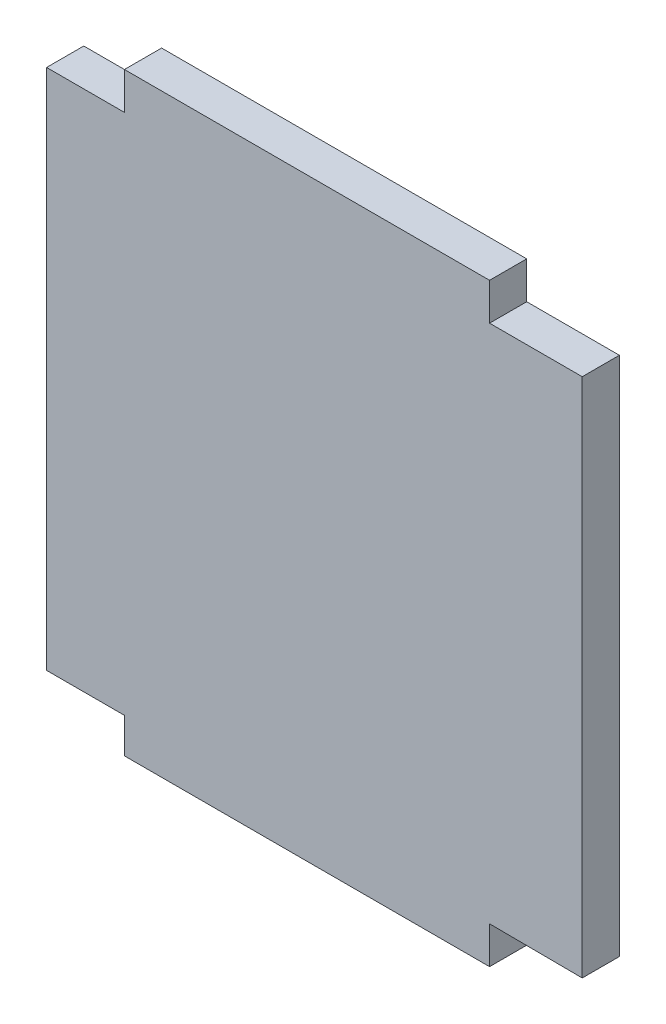
ISO-10303-21;
HEADER;
FILE_DESCRIPTION(('STEP AP214'),'2;1');
FILE_NAME('part.step','',(''),(''),'','','');
FILE_SCHEMA(('AUTOMOTIVE_DESIGN { 1 0 10303 214 1 1 1 1 }'));
ENDSEC;
DATA;
#1=APPLICATION_CONTEXT('core data for automotive mechanical design processes');
#2=APPLICATION_PROTOCOL_DEFINITION('international standard','automotive_design',2000,#1);
#3=PRODUCT_CONTEXT('',#1,'mechanical');
#4=PRODUCT('Part','Part','',(#3));
#5=PRODUCT_RELATED_PRODUCT_CATEGORY('part','',(#4));
#6=PRODUCT_DEFINITION_FORMATION('','',#4);
#7=PRODUCT_DEFINITION_CONTEXT('part definition',#1,'design');
#8=PRODUCT_DEFINITION('design','',#6,#7);
#9=PRODUCT_DEFINITION_SHAPE('','',#8);
#10=(LENGTH_UNIT() NAMED_UNIT(*) SI_UNIT(.MILLI.,.METRE.));
#11=(NAMED_UNIT(*) PLANE_ANGLE_UNIT() SI_UNIT($,.RADIAN.));
#12=(NAMED_UNIT(*) SI_UNIT($,.STERADIAN.) SOLID_ANGLE_UNIT());
#13=UNCERTAINTY_MEASURE_WITH_UNIT(LENGTH_MEASURE(1.E-05),#10,'distance_accuracy_value','');
#14=(GEOMETRIC_REPRESENTATION_CONTEXT(3) GLOBAL_UNCERTAINTY_ASSIGNED_CONTEXT((#13)) GLOBAL_UNIT_ASSIGNED_CONTEXT((#10,
#11,#12)) REPRESENTATION_CONTEXT('',''));
#15=CARTESIAN_POINT('',(0.,0.,0.));
#16=DIRECTION('',(0.,0.,1.));
#17=DIRECTION('',(1.,0.,0.));
#18=AXIS2_PLACEMENT_3D('',#15,#16,#17);
#19=CARTESIAN_POINT('',(-60.7832696373602,115.911666867358,5.08));
#20=DIRECTION('',(0.,-1.,0.));
#21=DIRECTION('',(0.,0.,-1.));
#22=AXIS2_PLACEMENT_3D('',#19,#20,#21);
#23=PLANE('',#22);
#24=DIRECTION('',(-1.,0.,0.));
#25=VECTOR('',#24,1.);
#26=CARTESIAN_POINT('',(-60.7832696373602,115.911666867358,0.));
#27=LINE('',#26,#25);
#28=CARTESIAN_POINT('',(-60.7832696373602,115.911666867358,0.));
#29=VERTEX_POINT('',#28);
#30=CARTESIAN_POINT('',(-71.4262491907789,115.911666867358,0.));
#31=VERTEX_POINT('',#30);
#32=EDGE_CURVE('E152',#29,#31,#27,.T.);
#33=ORIENTED_EDGE('',*,*,#32,.T.);
#34=DIRECTION('',(0.,0.,-1.));
#35=VECTOR('',#34,1.);
#36=CARTESIAN_POINT('',(-71.4262491907789,115.911666867358,5.08));
#37=LINE('',#36,#35);
#38=CARTESIAN_POINT('',(-71.4262491907789,115.911666867358,5.08));
#39=VERTEX_POINT('',#38);
#40=EDGE_CURVE('E11',#39,#31,#37,.T.);
#41=ORIENTED_EDGE('',*,*,#40,.F.);
#42=DIRECTION('',(-1.,0.,0.));
#43=VECTOR('',#42,1.);
#44=CARTESIAN_POINT('',(-60.7832696373602,115.911666867358,5.08));
#45=LINE('',#44,#43);
#46=CARTESIAN_POINT('',(-60.7832696373602,115.911666867358,5.08));
#47=VERTEX_POINT('',#46);
#48=EDGE_CURVE('E98',#47,#39,#45,.T.);
#49=ORIENTED_EDGE('',*,*,#48,.F.);
#50=DIRECTION('',(0.,0.,-1.));
#51=VECTOR('',#50,1.);
#52=CARTESIAN_POINT('',(-60.7832696373602,115.911666867358,5.08));
#53=LINE('',#52,#51);
#54=EDGE_CURVE('E49',#47,#29,#53,.T.);
#55=ORIENTED_EDGE('',*,*,#54,.T.);
#56=EDGE_LOOP('',(#33,#41,#49,#55));
#57=FACE_BOUND('',#56,.T.);
#58=ADVANCED_FACE('F33',(#57),#23,.F.);
#59=CARTESIAN_POINT('',(-71.4262491907789,44.5113060352469,5.08));
#60=DIRECTION('',(-1.,0.,0.));
#61=DIRECTION('',(0.,0.,1.));
#62=AXIS2_PLACEMENT_3D('',#59,#60,#61);
#63=PLANE('',#62);
#64=DIRECTION('',(0.,1.,0.));
#65=VECTOR('',#64,1.);
#66=CARTESIAN_POINT('',(-71.4262491907789,44.5113060352469,0.));
#67=LINE('',#66,#65);
#68=CARTESIAN_POINT('',(-71.4262491907789,44.5113060352469,0.));
#69=VERTEX_POINT('',#68);
#70=EDGE_CURVE('E154',#69,#31,#67,.T.);
#71=ORIENTED_EDGE('',*,*,#70,.F.);
#72=DIRECTION('',(0.,0.,-1.));
#73=VECTOR('',#72,1.);
#74=CARTESIAN_POINT('',(-71.4262491907789,44.5113060352469,5.08));
#75=LINE('',#74,#73);
#76=CARTESIAN_POINT('',(-71.4262491907789,44.5113060352469,5.08));
#77=VERTEX_POINT('',#76);
#78=EDGE_CURVE('E41',#77,#69,#75,.T.);
#79=ORIENTED_EDGE('',*,*,#78,.F.);
#80=DIRECTION('',(0.,1.,0.));
#81=VECTOR('',#80,1.);
#82=CARTESIAN_POINT('',(-71.4262491907789,44.5113060352469,5.08));
#83=LINE('',#82,#81);
#84=EDGE_CURVE('E211',#77,#39,#83,.T.);
#85=ORIENTED_EDGE('',*,*,#84,.T.);
#86=ORIENTED_EDGE('',*,*,#40,.T.);
#87=EDGE_LOOP('',(#71,#79,#85,#86));
#88=FACE_BOUND('',#87,.T.);
#89=ADVANCED_FACE('F210',(#88),#63,.T.);
#90=CARTESIAN_POINT('',(-71.4262491907789,44.5113060352469,5.08));
#91=DIRECTION('',(0.,1.,0.));
#92=DIRECTION('',(0.,0.,1.));
#93=AXIS2_PLACEMENT_3D('',#90,#91,#92);
#94=PLANE('',#93);
#95=DIRECTION('',(1.,0.,0.));
#96=VECTOR('',#95,1.);
#97=CARTESIAN_POINT('',(-71.4262491907789,44.5113060352469,0.));
#98=LINE('',#97,#96);
#99=CARTESIAN_POINT('',(-60.7832696373601,44.5113060352469,0.));
#100=VERTEX_POINT('',#99);
#101=EDGE_CURVE('E157',#69,#100,#98,.T.);
#102=ORIENTED_EDGE('',*,*,#101,.T.);
#103=DIRECTION('',(0.,0.,-1.));
#104=VECTOR('',#103,1.);
#105=CARTESIAN_POINT('',(-60.7832696373601,44.5113060352469,5.08));
#106=LINE('',#105,#104);
#107=CARTESIAN_POINT('',(-60.7832696373601,44.5113060352469,5.08));
#108=VERTEX_POINT('',#107);
#109=EDGE_CURVE('E197',#108,#100,#106,.T.);
#110=ORIENTED_EDGE('',*,*,#109,.F.);
#111=DIRECTION('',(1.,0.,0.));
#112=VECTOR('',#111,1.);
#113=CARTESIAN_POINT('',(-71.4262491907789,44.5113060352469,5.08));
#114=LINE('',#113,#112);
#115=EDGE_CURVE('E203',#77,#108,#114,.T.);
#116=ORIENTED_EDGE('',*,*,#115,.F.);
#117=ORIENTED_EDGE('',*,*,#78,.T.);
#118=EDGE_LOOP('',(#102,#110,#116,#117));
#119=FACE_BOUND('',#118,.T.);
#120=ADVANCED_FACE('F201',(#119),#94,.F.);
#121=CARTESIAN_POINT('',(-60.7832696373601,39.7116668673583,5.08));
#122=DIRECTION('',(-1.,0.,0.));
#123=DIRECTION('',(0.,0.,1.));
#124=AXIS2_PLACEMENT_3D('',#121,#122,#123);
#125=PLANE('',#124);
#126=DIRECTION('',(0.,1.,0.));
#127=VECTOR('',#126,1.);
#128=CARTESIAN_POINT('',(-60.7832696373601,39.7116668673583,0.));
#129=LINE('',#128,#127);
#130=CARTESIAN_POINT('',(-60.7832696373601,39.7116668673583,0.));
#131=VERTEX_POINT('',#130);
#132=EDGE_CURVE('E160',#131,#100,#129,.T.);
#133=ORIENTED_EDGE('',*,*,#132,.F.);
#134=DIRECTION('',(0.,0.,-1.));
#135=VECTOR('',#134,1.);
#136=CARTESIAN_POINT('',(-60.7832696373601,39.7116668673583,5.08));
#137=LINE('',#136,#135);
#138=CARTESIAN_POINT('',(-60.7832696373601,39.7116668673583,5.08));
#139=VERTEX_POINT('',#138);
#140=EDGE_CURVE('E195',#139,#131,#137,.T.);
#141=ORIENTED_EDGE('',*,*,#140,.F.);
#142=DIRECTION('',(0.,1.,0.));
#143=VECTOR('',#142,1.);
#144=CARTESIAN_POINT('',(-60.7832696373601,39.7116668673583,5.08));
#145=LINE('',#144,#143);
#146=EDGE_CURVE('E352',#139,#108,#145,.T.);
#147=ORIENTED_EDGE('',*,*,#146,.T.);
#148=ORIENTED_EDGE('',*,*,#109,.T.);
#149=EDGE_LOOP('',(#133,#141,#147,#148));
#150=FACE_BOUND('',#149,.T.);
#151=ADVANCED_FACE('F229',(#150),#125,.T.);
#152=CARTESIAN_POINT('',(-10.8593708258029,39.7116668673583,5.08));
#153=DIRECTION('',(0.,-1.,0.));
#154=DIRECTION('',(0.,0.,-1.));
#155=AXIS2_PLACEMENT_3D('',#152,#153,#154);
#156=PLANE('',#155);
#157=DIRECTION('',(-1.,0.,0.));
#158=VECTOR('',#157,1.);
#159=CARTESIAN_POINT('',(-10.8593708258029,39.7116668673583,0.));
#160=LINE('',#159,#158);
#161=CARTESIAN_POINT('',(-10.8593708258029,39.7116668673583,0.));
#162=VERTEX_POINT('',#161);
#163=EDGE_CURVE('E163',#162,#131,#160,.T.);
#164=ORIENTED_EDGE('',*,*,#163,.F.);
#165=DIRECTION('',(0.,0.,-1.));
#166=VECTOR('',#165,1.);
#167=CARTESIAN_POINT('',(-10.8593708258029,39.7116668673583,5.08));
#168=LINE('',#167,#166);
#169=CARTESIAN_POINT('',(-10.8593708258029,39.7116668673583,5.08));
#170=VERTEX_POINT('',#169);
#171=EDGE_CURVE('E193',#170,#162,#168,.T.);
#172=ORIENTED_EDGE('',*,*,#171,.F.);
#173=DIRECTION('',(-1.,0.,0.));
#174=VECTOR('',#173,1.);
#175=CARTESIAN_POINT('',(-10.8593708258029,39.7116668673583,5.08));
#176=LINE('',#175,#174);
#177=EDGE_CURVE('E349',#170,#139,#176,.T.);
#178=ORIENTED_EDGE('',*,*,#177,.T.);
#179=ORIENTED_EDGE('',*,*,#140,.T.);
#180=EDGE_LOOP('',(#164,#172,#178,#179));
#181=FACE_BOUND('',#180,.T.);
#182=ADVANCED_FACE('F234',(#181),#156,.T.);
#183=CARTESIAN_POINT('',(-10.8593708258029,44.7916668673583,5.08));
#184=DIRECTION('',(1.,0.,0.));
#185=DIRECTION('',(0.,0.,-1.));
#186=AXIS2_PLACEMENT_3D('',#183,#184,#185);
#187=PLANE('',#186);
#188=DIRECTION('',(0.,-1.,0.));
#189=VECTOR('',#188,1.);
#190=CARTESIAN_POINT('',(-10.8593708258029,44.7916668673583,0.));
#191=LINE('',#190,#189);
#192=CARTESIAN_POINT('',(-10.8593708258029,44.7916668673583,0.));
#193=VERTEX_POINT('',#192);
#194=EDGE_CURVE('E166',#193,#162,#191,.T.);
#195=ORIENTED_EDGE('',*,*,#194,.F.);
#196=DIRECTION('',(0.,0.,-1.));
#197=VECTOR('',#196,1.);
#198=CARTESIAN_POINT('',(-10.8593708258029,44.7916668673583,5.08));
#199=LINE('',#198,#197);
#200=CARTESIAN_POINT('',(-10.8593708258029,44.7916668673583,5.08));
#201=VERTEX_POINT('',#200);
#202=EDGE_CURVE('E191',#201,#193,#199,.T.);
#203=ORIENTED_EDGE('',*,*,#202,.F.);
#204=DIRECTION('',(0.,-1.,0.));
#205=VECTOR('',#204,1.);
#206=CARTESIAN_POINT('',(-10.8593708258029,44.7916668673583,5.08));
#207=LINE('',#206,#205);
#208=EDGE_CURVE('E354',#201,#170,#207,.T.);
#209=ORIENTED_EDGE('',*,*,#208,.T.);
#210=ORIENTED_EDGE('',*,*,#171,.T.);
#211=EDGE_LOOP('',(#195,#203,#209,#210));
#212=FACE_BOUND('',#211,.T.);
#213=ADVANCED_FACE('F238',(#212),#187,.T.);
#214=CARTESIAN_POINT('',(1.81378225928519,44.7079104796684,5.08));
#215=DIRECTION('',(-0.00660881771220687,-0.999978161525764,0.));
#216=DIRECTION('',(0.999978161525764,-0.00660881771220687,0.));
#217=AXIS2_PLACEMENT_3D('',#214,#215,#216);
#218=PLANE('',#217);
#219=DIRECTION('',(-0.999978161525764,0.00660881771220687,0.));
#220=VECTOR('',#219,1.);
#221=CARTESIAN_POINT('',(1.81378225928519,44.7079104796684,0.));
#222=LINE('',#221,#220);
#223=CARTESIAN_POINT('',(1.81378225928519,44.7079104796684,0.));
#224=VERTEX_POINT('',#223);
#225=EDGE_CURVE('E169',#224,#193,#222,.T.);
#226=ORIENTED_EDGE('',*,*,#225,.F.);
#227=DIRECTION('',(0.,0.,-1.));
#228=VECTOR('',#227,1.);
#229=CARTESIAN_POINT('',(1.81378225928519,44.7079104796684,5.08));
#230=LINE('',#229,#228);
#231=CARTESIAN_POINT('',(1.81378225928519,44.7079104796684,5.08));
#232=VERTEX_POINT('',#231);
#233=EDGE_CURVE('E189',#232,#224,#230,.T.);
#234=ORIENTED_EDGE('',*,*,#233,.F.);
#235=DIRECTION('',(-0.999978161525764,0.00660881771220687,0.));
#236=VECTOR('',#235,1.);
#237=CARTESIAN_POINT('',(1.81378225928519,44.7079104796684,5.08));
#238=LINE('',#237,#236);
#239=EDGE_CURVE('E343',#232,#201,#238,.T.);
#240=ORIENTED_EDGE('',*,*,#239,.T.);
#241=ORIENTED_EDGE('',*,*,#202,.T.);
#242=EDGE_LOOP('',(#226,#234,#240,#241));
#243=FACE_BOUND('',#242,.T.);
#244=ADVANCED_FACE('F242',(#243),#218,.T.);
#245=CARTESIAN_POINT('',(1.81378225928519,115.911666867358,5.08));
#246=DIRECTION('',(1.,0.,0.));
#247=DIRECTION('',(0.,0.,-1.));
#248=AXIS2_PLACEMENT_3D('',#245,#246,#247);
#249=PLANE('',#248);
#250=DIRECTION('',(0.,-1.,0.));
#251=VECTOR('',#250,1.);
#252=CARTESIAN_POINT('',(1.81378225928519,115.911666867358,0.));
#253=LINE('',#252,#251);
#254=CARTESIAN_POINT('',(1.81378225928519,115.911666867358,0.));
#255=VERTEX_POINT('',#254);
#256=EDGE_CURVE('E172',#255,#224,#253,.T.);
#257=ORIENTED_EDGE('',*,*,#256,.F.);
#258=DIRECTION('',(0.,0.,-1.));
#259=VECTOR('',#258,1.);
#260=CARTESIAN_POINT('',(1.81378225928519,115.911666867358,5.08));
#261=LINE('',#260,#259);
#262=CARTESIAN_POINT('',(1.81378225928519,115.911666867358,5.08));
#263=VERTEX_POINT('',#262);
#264=EDGE_CURVE('E187',#263,#255,#261,.T.);
#265=ORIENTED_EDGE('',*,*,#264,.F.);
#266=DIRECTION('',(0.,-1.,0.));
#267=VECTOR('',#266,1.);
#268=CARTESIAN_POINT('',(1.81378225928519,115.911666867358,5.08));
#269=LINE('',#268,#267);
#270=EDGE_CURVE('E339',#263,#232,#269,.T.);
#271=ORIENTED_EDGE('',*,*,#270,.T.);
#272=ORIENTED_EDGE('',*,*,#233,.T.);
#273=EDGE_LOOP('',(#257,#265,#271,#272));
#274=FACE_BOUND('',#273,.T.);
#275=ADVANCED_FACE('F246',(#274),#249,.T.);
#276=CARTESIAN_POINT('',(-10.8593708258029,115.911666867358,5.08));
#277=DIRECTION('',(0.,1.,0.));
#278=DIRECTION('',(0.,0.,1.));
#279=AXIS2_PLACEMENT_3D('',#276,#277,#278);
#280=PLANE('',#279);
#281=DIRECTION('',(1.,0.,0.));
#282=VECTOR('',#281,1.);
#283=CARTESIAN_POINT('',(-10.8593708258029,115.911666867358,0.));
#284=LINE('',#283,#282);
#285=CARTESIAN_POINT('',(-10.8593708258029,115.911666867358,0.));
#286=VERTEX_POINT('',#285);
#287=EDGE_CURVE('E175',#286,#255,#284,.T.);
#288=ORIENTED_EDGE('',*,*,#287,.F.);
#289=DIRECTION('',(0.,0.,-1.));
#290=VECTOR('',#289,1.);
#291=CARTESIAN_POINT('',(-10.8593708258029,115.911666867358,5.08));
#292=LINE('',#291,#290);
#293=CARTESIAN_POINT('',(-10.8593708258029,115.911666867358,5.08));
#294=VERTEX_POINT('',#293);
#295=EDGE_CURVE('E136',#294,#286,#292,.T.);
#296=ORIENTED_EDGE('',*,*,#295,.F.);
#297=DIRECTION('',(1.,0.,0.));
#298=VECTOR('',#297,1.);
#299=CARTESIAN_POINT('',(-10.8593708258029,115.911666867358,5.08));
#300=LINE('',#299,#298);
#301=EDGE_CURVE('E144',#294,#263,#300,.T.);
#302=ORIENTED_EDGE('',*,*,#301,.T.);
#303=ORIENTED_EDGE('',*,*,#264,.T.);
#304=EDGE_LOOP('',(#288,#296,#302,#303));
#305=FACE_BOUND('',#304,.T.);
#306=ADVANCED_FACE('F250',(#305),#280,.T.);
#307=CARTESIAN_POINT('',(-10.8593708258029,120.991666867358,5.08));
#308=DIRECTION('',(1.,0.,0.));
#309=DIRECTION('',(0.,0.,-1.));
#310=AXIS2_PLACEMENT_3D('',#307,#308,#309);
#311=PLANE('',#310);
#312=DIRECTION('',(0.,-1.,0.));
#313=VECTOR('',#312,1.);
#314=CARTESIAN_POINT('',(-10.8593708258029,120.991666867358,0.));
#315=LINE('',#314,#313);
#316=CARTESIAN_POINT('',(-10.8593708258029,120.991666867358,0.));
#317=VERTEX_POINT('',#316);
#318=EDGE_CURVE('E132',#317,#286,#315,.T.);
#319=ORIENTED_EDGE('',*,*,#318,.F.);
#320=DIRECTION('',(0.,0.,-1.));
#321=VECTOR('',#320,1.);
#322=CARTESIAN_POINT('',(-10.8593708258029,120.991666867358,5.08));
#323=LINE('',#322,#321);
#324=CARTESIAN_POINT('',(-10.8593708258029,120.991666867358,5.08));
#325=VERTEX_POINT('',#324);
#326=EDGE_CURVE('E127',#325,#317,#323,.T.);
#327=ORIENTED_EDGE('',*,*,#326,.F.);
#328=DIRECTION('',(0.,-1.,0.));
#329=VECTOR('',#328,1.);
#330=CARTESIAN_POINT('',(-10.8593708258029,120.991666867358,5.08));
#331=LINE('',#330,#329);
#332=EDGE_CURVE('E130',#325,#294,#331,.T.);
#333=ORIENTED_EDGE('',*,*,#332,.T.);
#334=ORIENTED_EDGE('',*,*,#295,.T.);
#335=EDGE_LOOP('',(#319,#327,#333,#334));
#336=FACE_BOUND('',#335,.T.);
#337=ADVANCED_FACE('F129',(#336),#311,.T.);
#338=CARTESIAN_POINT('',(-60.7832696373602,120.991666867358,5.08));
#339=DIRECTION('',(0.,1.,0.));
#340=DIRECTION('',(0.,0.,1.));
#341=AXIS2_PLACEMENT_3D('',#338,#339,#340);
#342=PLANE('',#341);
#343=DIRECTION('',(1.,0.,0.));
#344=VECTOR('',#343,1.);
#345=CARTESIAN_POINT('',(-60.7832696373602,120.991666867358,0.));
#346=LINE('',#345,#344);
#347=CARTESIAN_POINT('',(-60.7832696373602,120.991666867358,0.));
#348=VERTEX_POINT('',#347);
#349=EDGE_CURVE('E179',#348,#317,#346,.T.);
#350=ORIENTED_EDGE('',*,*,#349,.F.);
#351=DIRECTION('',(0.,0.,-1.));
#352=VECTOR('',#351,1.);
#353=CARTESIAN_POINT('',(-60.7832696373602,120.991666867358,5.08));
#354=LINE('',#353,#352);
#355=CARTESIAN_POINT('',(-60.7832696373602,120.991666867358,5.08));
#356=VERTEX_POINT('',#355);
#357=EDGE_CURVE('E86',#356,#348,#354,.T.);
#358=ORIENTED_EDGE('',*,*,#357,.F.);
#359=DIRECTION('',(1.,0.,0.));
#360=VECTOR('',#359,1.);
#361=CARTESIAN_POINT('',(-60.7832696373602,120.991666867358,5.08));
#362=LINE('',#361,#360);
#363=EDGE_CURVE('E141',#356,#325,#362,.T.);
#364=ORIENTED_EDGE('',*,*,#363,.T.);
#365=ORIENTED_EDGE('',*,*,#326,.T.);
#366=EDGE_LOOP('',(#350,#358,#364,#365));
#367=FACE_BOUND('',#366,.T.);
#368=ADVANCED_FACE('F146',(#367),#342,.T.);
#369=CARTESIAN_POINT('',(-60.7832696373602,115.911666867358,5.08));
#370=DIRECTION('',(-1.,0.,0.));
#371=DIRECTION('',(0.,0.,1.));
#372=AXIS2_PLACEMENT_3D('',#369,#370,#371);
#373=PLANE('',#372);
#374=DIRECTION('',(0.,1.,0.));
#375=VECTOR('',#374,1.);
#376=CARTESIAN_POINT('',(-60.7832696373602,115.911666867358,0.));
#377=LINE('',#376,#375);
#378=EDGE_CURVE('E181',#29,#348,#377,.T.);
#379=ORIENTED_EDGE('',*,*,#378,.F.);
#380=ORIENTED_EDGE('',*,*,#54,.F.);
#381=DIRECTION('',(0.,1.,0.));
#382=VECTOR('',#381,1.);
#383=CARTESIAN_POINT('',(-60.7832696373602,115.911666867358,5.08));
#384=LINE('',#383,#382);
#385=EDGE_CURVE('E147',#47,#356,#384,.T.);
#386=ORIENTED_EDGE('',*,*,#385,.T.);
#387=ORIENTED_EDGE('',*,*,#357,.T.);
#388=EDGE_LOOP('',(#379,#380,#386,#387));
#389=FACE_BOUND('',#388,.T.);
#390=ADVANCED_FACE('F212',(#389),#373,.T.);
#391=CARTESIAN_POINT('',(0.,0.,5.08));
#392=DIRECTION('',(0.,0.,-1.));
#393=DIRECTION('',(-1.,0.,0.));
#394=AXIS2_PLACEMENT_3D('',#391,#392,#393);
#395=PLANE('',#394);
#396=ORIENTED_EDGE('',*,*,#48,.T.);
#397=ORIENTED_EDGE('',*,*,#84,.F.);
#398=ORIENTED_EDGE('',*,*,#115,.T.);
#399=ORIENTED_EDGE('',*,*,#146,.F.);
#400=ORIENTED_EDGE('',*,*,#177,.F.);
#401=ORIENTED_EDGE('',*,*,#208,.F.);
#402=ORIENTED_EDGE('',*,*,#239,.F.);
#403=ORIENTED_EDGE('',*,*,#270,.F.);
#404=ORIENTED_EDGE('',*,*,#301,.F.);
#405=ORIENTED_EDGE('',*,*,#332,.F.);
#406=ORIENTED_EDGE('',*,*,#363,.F.);
#407=ORIENTED_EDGE('',*,*,#385,.F.);
#408=EDGE_LOOP('',(#396,#397,#398,#399,#400,#401,#402,#403,#404,#405,#406,#407));
#409=FACE_BOUND('',#408,.T.);
#410=ADVANCED_FACE('F140',(#409),#395,.F.);
#411=CARTESIAN_POINT('',(0.,0.,0.));
#412=DIRECTION('',(0.,0.,-1.));
#413=DIRECTION('',(-1.,0.,0.));
#414=AXIS2_PLACEMENT_3D('',#411,#412,#413);
#415=PLANE('',#414);
#416=ORIENTED_EDGE('',*,*,#32,.F.);
#417=ORIENTED_EDGE('',*,*,#378,.T.);
#418=ORIENTED_EDGE('',*,*,#349,.T.);
#419=ORIENTED_EDGE('',*,*,#318,.T.);
#420=ORIENTED_EDGE('',*,*,#287,.T.);
#421=ORIENTED_EDGE('',*,*,#256,.T.);
#422=ORIENTED_EDGE('',*,*,#225,.T.);
#423=ORIENTED_EDGE('',*,*,#194,.T.);
#424=ORIENTED_EDGE('',*,*,#163,.T.);
#425=ORIENTED_EDGE('',*,*,#132,.T.);
#426=ORIENTED_EDGE('',*,*,#101,.F.);
#427=ORIENTED_EDGE('',*,*,#70,.T.);
#428=EDGE_LOOP('',(#416,#417,#418,#419,#420,#421,#422,#423,#424,#425,#426,#427));
#429=FACE_BOUND('',#428,.T.);
#430=ADVANCED_FACE('F208',(#429),#415,.T.);
#431=CLOSED_SHELL('',(#58,#89,#120,#151,#182,#213,#244,#275,#306,#337,#368,#390,#410,#430));
#432=MANIFOLD_SOLID_BREP('B2',#431);
#433=ADVANCED_BREP_SHAPE_REPRESENTATION('',(#18,#432),#14);
#434=SHAPE_DEFINITION_REPRESENTATION(#9,#433);
ENDSEC;
END-ISO-10303-21;
